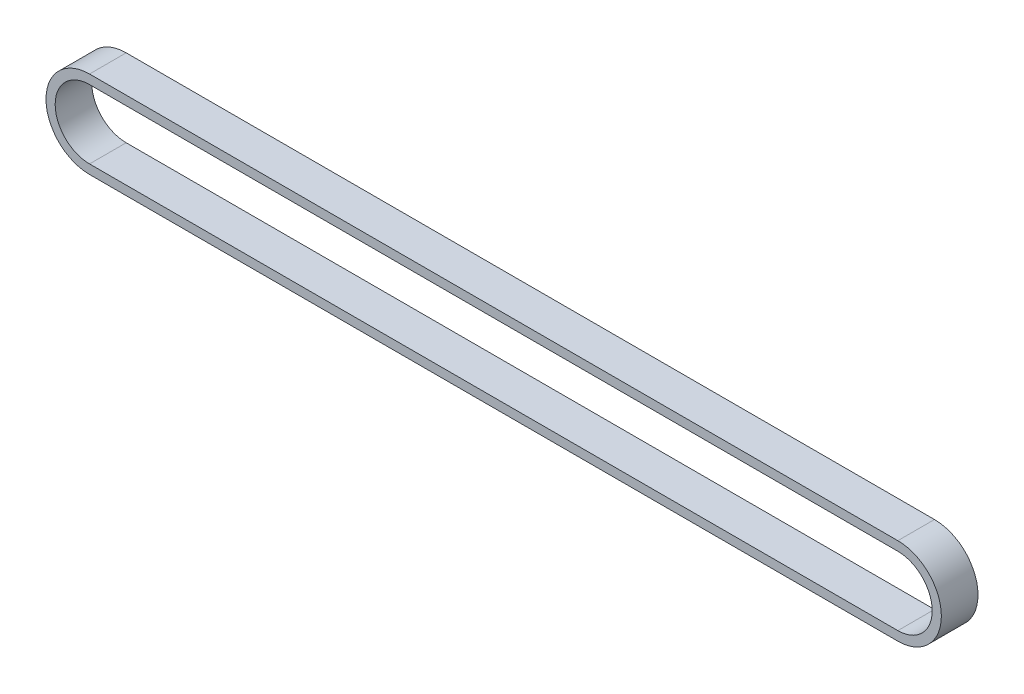
ISO-10303-21;
HEADER;
FILE_DESCRIPTION(('STEP AP214'),'2;1');
FILE_NAME('part.step','',(''),(''),'','','');
FILE_SCHEMA(('AUTOMOTIVE_DESIGN { 1 0 10303 214 1 1 1 1 }'));
ENDSEC;
DATA;
#1=APPLICATION_CONTEXT('core data for automotive mechanical design processes');
#2=APPLICATION_PROTOCOL_DEFINITION('international standard','automotive_design',2000,#1);
#3=PRODUCT_CONTEXT('',#1,'mechanical');
#4=PRODUCT('Part','Part','',(#3));
#5=PRODUCT_RELATED_PRODUCT_CATEGORY('part','',(#4));
#6=PRODUCT_DEFINITION_FORMATION('','',#4);
#7=PRODUCT_DEFINITION_CONTEXT('part definition',#1,'design');
#8=PRODUCT_DEFINITION('design','',#6,#7);
#9=PRODUCT_DEFINITION_SHAPE('','',#8);
#10=(LENGTH_UNIT() NAMED_UNIT(*) SI_UNIT(.MILLI.,.METRE.));
#11=(NAMED_UNIT(*) PLANE_ANGLE_UNIT() SI_UNIT($,.RADIAN.));
#12=(NAMED_UNIT(*) SI_UNIT($,.STERADIAN.) SOLID_ANGLE_UNIT());
#13=UNCERTAINTY_MEASURE_WITH_UNIT(LENGTH_MEASURE(1.E-05),#10,'distance_accuracy_value','');
#14=(GEOMETRIC_REPRESENTATION_CONTEXT(3) GLOBAL_UNCERTAINTY_ASSIGNED_CONTEXT((#13)) GLOBAL_UNIT_ASSIGNED_CONTEXT((#10,
#11,#12)) REPRESENTATION_CONTEXT('',''));
#15=CARTESIAN_POINT('',(0.,0.,0.));
#16=DIRECTION('',(0.,0.,1.));
#17=DIRECTION('',(1.,0.,0.));
#18=AXIS2_PLACEMENT_3D('',#15,#16,#17);
#19=CARTESIAN_POINT('',(-112.038165052,0.,10.16));
#20=DIRECTION('',(0.,0.,1.));
#21=DIRECTION('',(1.,0.,0.));
#22=AXIS2_PLACEMENT_3D('',#19,#20,#21);
#23=PLANE('',#22);
#24=CARTESIAN_POINT('',(-112.038165052,0.,10.16));
#25=DIRECTION('',(0.,0.,1.));
#26=DIRECTION('',(1.,0.,0.));
#27=AXIS2_PLACEMENT_3D('',#24,#25,#26);
#28=CIRCLE('',#27,12.065);
#29=CARTESIAN_POINT('',(-112.038165052,12.065,10.16));
#30=VERTEX_POINT('',#29);
#31=CARTESIAN_POINT('',(-112.038165052,-12.065,10.16));
#32=VERTEX_POINT('',#31);
#33=EDGE_CURVE('E135',#30,#32,#28,.T.);
#34=ORIENTED_EDGE('',*,*,#33,.T.);
#35=DIRECTION('',(1.,0.,0.));
#36=VECTOR('',#35,1.);
#37=CARTESIAN_POINT('',(-112.038165052,-12.065,10.16));
#38=LINE('',#37,#36);
#39=CARTESIAN_POINT('',(112.038165052,-12.0649999999999,10.16));
#40=VERTEX_POINT('',#39);
#41=EDGE_CURVE('E138',#32,#40,#38,.T.);
#42=ORIENTED_EDGE('',*,*,#41,.T.);
#43=CARTESIAN_POINT('',(112.038165052,0.,10.16));
#44=DIRECTION('',(0.,0.,1.));
#45=DIRECTION('',(1.,0.,0.));
#46=AXIS2_PLACEMENT_3D('',#43,#44,#45);
#47=CIRCLE('',#46,12.065);
#48=CARTESIAN_POINT('',(112.038165052,12.065,10.16));
#49=VERTEX_POINT('',#48);
#50=EDGE_CURVE('E141',#40,#49,#47,.T.);
#51=ORIENTED_EDGE('',*,*,#50,.T.);
#52=DIRECTION('',(-1.,0.,0.));
#53=VECTOR('',#52,1.);
#54=CARTESIAN_POINT('',(-112.038165052,12.065,10.16));
#55=LINE('',#54,#53);
#56=EDGE_CURVE('E143',#49,#30,#55,.T.);
#57=ORIENTED_EDGE('',*,*,#56,.T.);
#58=EDGE_LOOP('',(#34,#42,#51,#57));
#59=FACE_BOUND('',#58,.T.);
#60=DIRECTION('',(1.,0.,0.));
#61=VECTOR('',#60,1.);
#62=CARTESIAN_POINT('',(-112.038165052,-9.525,10.16));
#63=LINE('',#62,#61);
#64=CARTESIAN_POINT('',(-112.038165052,-9.525,10.16));
#65=VERTEX_POINT('',#64);
#66=CARTESIAN_POINT('',(112.038165052,-9.52499999999996,10.16));
#67=VERTEX_POINT('',#66);
#68=EDGE_CURVE('E107',#65,#67,#63,.T.);
#69=ORIENTED_EDGE('',*,*,#68,.F.);
#70=CARTESIAN_POINT('',(-112.038165052,0.,10.16));
#71=DIRECTION('',(0.,0.,1.));
#72=DIRECTION('',(1.,0.,0.));
#73=AXIS2_PLACEMENT_3D('',#70,#71,#72);
#74=CIRCLE('',#73,9.525);
#75=CARTESIAN_POINT('',(-112.038165052,9.525,10.16));
#76=VERTEX_POINT('',#75);
#77=EDGE_CURVE('E99',#76,#65,#74,.T.);
#78=ORIENTED_EDGE('',*,*,#77,.F.);
#79=DIRECTION('',(-1.,0.,0.));
#80=VECTOR('',#79,1.);
#81=CARTESIAN_POINT('',(-112.038165052,9.525,10.16));
#82=LINE('',#81,#80);
#83=CARTESIAN_POINT('',(112.038165052,9.52500000000004,10.16));
#84=VERTEX_POINT('',#83);
#85=EDGE_CURVE('E121',#84,#76,#82,.T.);
#86=ORIENTED_EDGE('',*,*,#85,.F.);
#87=CARTESIAN_POINT('',(112.038165052,0.,10.16));
#88=DIRECTION('',(0.,0.,1.));
#89=DIRECTION('',(1.,0.,0.));
#90=AXIS2_PLACEMENT_3D('',#87,#88,#89);
#91=CIRCLE('',#90,9.525);
#92=EDGE_CURVE('E119',#67,#84,#91,.T.);
#93=ORIENTED_EDGE('',*,*,#92,.F.);
#94=EDGE_LOOP('',(#69,#78,#86,#93));
#95=FACE_BOUND('',#94,.T.);
#96=ADVANCED_FACE('F34',(#59,#95),#23,.T.);
#97=CARTESIAN_POINT('',(-112.038165052,0.,0.));
#98=DIRECTION('',(0.,0.,1.));
#99=DIRECTION('',(1.,0.,0.));
#100=AXIS2_PLACEMENT_3D('',#97,#98,#99);
#101=PLANE('',#100);
#102=CARTESIAN_POINT('',(-112.038165052,0.,0.));
#103=DIRECTION('',(0.,0.,1.));
#104=DIRECTION('',(1.,0.,0.));
#105=AXIS2_PLACEMENT_3D('',#102,#103,#104);
#106=CIRCLE('',#105,12.065);
#107=CARTESIAN_POINT('',(-112.038165052,12.065,0.));
#108=VERTEX_POINT('',#107);
#109=CARTESIAN_POINT('',(-112.038165052,-12.065,0.));
#110=VERTEX_POINT('',#109);
#111=EDGE_CURVE('E115',#108,#110,#106,.T.);
#112=ORIENTED_EDGE('',*,*,#111,.F.);
#113=DIRECTION('',(-1.,0.,0.));
#114=VECTOR('',#113,1.);
#115=CARTESIAN_POINT('',(-112.038165052,12.065,0.));
#116=LINE('',#115,#114);
#117=CARTESIAN_POINT('',(112.038165052,12.065,0.));
#118=VERTEX_POINT('',#117);
#119=EDGE_CURVE('E139',#118,#108,#116,.T.);
#120=ORIENTED_EDGE('',*,*,#119,.F.);
#121=CARTESIAN_POINT('',(112.038165052,0.,0.));
#122=DIRECTION('',(0.,0.,1.));
#123=DIRECTION('',(1.,0.,0.));
#124=AXIS2_PLACEMENT_3D('',#121,#122,#123);
#125=CIRCLE('',#124,12.065);
#126=CARTESIAN_POINT('',(112.038165052,-12.0649999999999,0.));
#127=VERTEX_POINT('',#126);
#128=EDGE_CURVE('E150',#127,#118,#125,.T.);
#129=ORIENTED_EDGE('',*,*,#128,.F.);
#130=DIRECTION('',(1.,0.,0.));
#131=VECTOR('',#130,1.);
#132=CARTESIAN_POINT('',(-112.038165052,-12.065,0.));
#133=LINE('',#132,#131);
#134=EDGE_CURVE('E148',#110,#127,#133,.T.);
#135=ORIENTED_EDGE('',*,*,#134,.F.);
#136=EDGE_LOOP('',(#112,#120,#129,#135));
#137=FACE_BOUND('',#136,.T.);
#138=CARTESIAN_POINT('',(-112.038165052,0.,0.));
#139=DIRECTION('',(0.,0.,1.));
#140=DIRECTION('',(1.,0.,0.));
#141=AXIS2_PLACEMENT_3D('',#138,#139,#140);
#142=CIRCLE('',#141,9.525);
#143=CARTESIAN_POINT('',(-112.038165052,9.525,0.));
#144=VERTEX_POINT('',#143);
#145=CARTESIAN_POINT('',(-112.038165052,-9.525,0.));
#146=VERTEX_POINT('',#145);
#147=EDGE_CURVE('E57',#144,#146,#142,.T.);
#148=ORIENTED_EDGE('',*,*,#147,.T.);
#149=DIRECTION('',(1.,0.,0.));
#150=VECTOR('',#149,1.);
#151=CARTESIAN_POINT('',(-112.038165052,-9.525,0.));
#152=LINE('',#151,#150);
#153=CARTESIAN_POINT('',(112.038165052,-9.52499999999996,0.));
#154=VERTEX_POINT('',#153);
#155=EDGE_CURVE('E114',#146,#154,#152,.T.);
#156=ORIENTED_EDGE('',*,*,#155,.T.);
#157=CARTESIAN_POINT('',(112.038165052,0.,0.));
#158=DIRECTION('',(0.,0.,1.));
#159=DIRECTION('',(1.,0.,0.));
#160=AXIS2_PLACEMENT_3D('',#157,#158,#159);
#161=CIRCLE('',#160,9.525);
#162=CARTESIAN_POINT('',(112.038165052,9.52500000000004,0.));
#163=VERTEX_POINT('',#162);
#164=EDGE_CURVE('E127',#154,#163,#161,.T.);
#165=ORIENTED_EDGE('',*,*,#164,.T.);
#166=DIRECTION('',(-1.,0.,0.));
#167=VECTOR('',#166,1.);
#168=CARTESIAN_POINT('',(-112.038165052,9.525,0.));
#169=LINE('',#168,#167);
#170=EDGE_CURVE('E108',#163,#144,#169,.T.);
#171=ORIENTED_EDGE('',*,*,#170,.T.);
#172=EDGE_LOOP('',(#148,#156,#165,#171));
#173=FACE_BOUND('',#172,.T.);
#174=ADVANCED_FACE('F168',(#137,#173),#101,.F.);
#175=CARTESIAN_POINT('',(-112.038165052,0.,10.16));
#176=DIRECTION('',(0.,0.,-1.));
#177=DIRECTION('',(-1.,0.,0.));
#178=AXIS2_PLACEMENT_3D('',#175,#176,#177);
#179=CYLINDRICAL_SURFACE('',#178,12.065);
#180=ORIENTED_EDGE('',*,*,#111,.T.);
#181=DIRECTION('',(0.,0.,-1.));
#182=VECTOR('',#181,1.);
#183=CARTESIAN_POINT('',(-112.038165052,-12.065,10.16));
#184=LINE('',#183,#182);
#185=EDGE_CURVE('E11',#32,#110,#184,.T.);
#186=ORIENTED_EDGE('',*,*,#185,.F.);
#187=ORIENTED_EDGE('',*,*,#33,.F.);
#188=DIRECTION('',(0.,0.,-1.));
#189=VECTOR('',#188,1.);
#190=CARTESIAN_POINT('',(-112.038165052,12.065,10.16));
#191=LINE('',#190,#189);
#192=EDGE_CURVE('E145',#30,#108,#191,.T.);
#193=ORIENTED_EDGE('',*,*,#192,.T.);
#194=EDGE_LOOP('',(#180,#186,#187,#193));
#195=FACE_BOUND('',#194,.T.);
#196=ADVANCED_FACE('F36',(#195),#179,.T.);
#197=CARTESIAN_POINT('',(-112.038165052,-12.065,10.16));
#198=DIRECTION('',(0.,1.,0.));
#199=DIRECTION('',(-1.,0.,0.));
#200=AXIS2_PLACEMENT_3D('',#197,#198,#199);
#201=PLANE('',#200);
#202=ORIENTED_EDGE('',*,*,#134,.T.);
#203=DIRECTION('',(0.,0.,-1.));
#204=VECTOR('',#203,1.);
#205=CARTESIAN_POINT('',(112.038165052,-12.0649999999999,10.16));
#206=LINE('',#205,#204);
#207=EDGE_CURVE('E42',#40,#127,#206,.T.);
#208=ORIENTED_EDGE('',*,*,#207,.F.);
#209=ORIENTED_EDGE('',*,*,#41,.F.);
#210=ORIENTED_EDGE('',*,*,#185,.T.);
#211=EDGE_LOOP('',(#202,#208,#209,#210));
#212=FACE_BOUND('',#211,.T.);
#213=ADVANCED_FACE('F178',(#212),#201,.F.);
#214=CARTESIAN_POINT('',(112.038165052,0.,10.16));
#215=DIRECTION('',(0.,0.,-1.));
#216=DIRECTION('',(-1.,0.,0.));
#217=AXIS2_PLACEMENT_3D('',#214,#215,#216);
#218=CYLINDRICAL_SURFACE('',#217,12.065);
#219=ORIENTED_EDGE('',*,*,#128,.T.);
#220=DIRECTION('',(0.,0.,-1.));
#221=VECTOR('',#220,1.);
#222=CARTESIAN_POINT('',(112.038165052,12.065,10.16));
#223=LINE('',#222,#221);
#224=EDGE_CURVE('E155',#49,#118,#223,.T.);
#225=ORIENTED_EDGE('',*,*,#224,.F.);
#226=ORIENTED_EDGE('',*,*,#50,.F.);
#227=ORIENTED_EDGE('',*,*,#207,.T.);
#228=EDGE_LOOP('',(#219,#225,#226,#227));
#229=FACE_BOUND('',#228,.T.);
#230=ADVANCED_FACE('F162',(#229),#218,.T.);
#231=CARTESIAN_POINT('',(-112.038165052,12.065,10.16));
#232=DIRECTION('',(0.,-1.,0.));
#233=DIRECTION('',(0.,0.,-1.));
#234=AXIS2_PLACEMENT_3D('',#231,#232,#233);
#235=PLANE('',#234);
#236=ORIENTED_EDGE('',*,*,#119,.T.);
#237=ORIENTED_EDGE('',*,*,#192,.F.);
#238=ORIENTED_EDGE('',*,*,#56,.F.);
#239=ORIENTED_EDGE('',*,*,#224,.T.);
#240=EDGE_LOOP('',(#236,#237,#238,#239));
#241=FACE_BOUND('',#240,.T.);
#242=ADVANCED_FACE('F172',(#241),#235,.F.);
#243=CARTESIAN_POINT('',(-112.038165052,0.,10.16));
#244=DIRECTION('',(0.,0.,-1.));
#245=DIRECTION('',(-1.,0.,0.));
#246=AXIS2_PLACEMENT_3D('',#243,#244,#245);
#247=CYLINDRICAL_SURFACE('',#246,9.525);
#248=ORIENTED_EDGE('',*,*,#147,.F.);
#249=DIRECTION('',(0.,0.,-1.));
#250=VECTOR('',#249,1.);
#251=CARTESIAN_POINT('',(-112.038165052,9.525,10.16));
#252=LINE('',#251,#250);
#253=EDGE_CURVE('E103',#76,#144,#252,.T.);
#254=ORIENTED_EDGE('',*,*,#253,.F.);
#255=ORIENTED_EDGE('',*,*,#77,.T.);
#256=DIRECTION('',(0.,0.,-1.));
#257=VECTOR('',#256,1.);
#258=CARTESIAN_POINT('',(-112.038165052,-9.525,10.16));
#259=LINE('',#258,#257);
#260=EDGE_CURVE('E102',#65,#146,#259,.T.);
#261=ORIENTED_EDGE('',*,*,#260,.T.);
#262=EDGE_LOOP('',(#248,#254,#255,#261));
#263=FACE_BOUND('',#262,.T.);
#264=ADVANCED_FACE('F101',(#263),#247,.F.);
#265=CARTESIAN_POINT('',(-112.038165052,-9.525,10.16));
#266=DIRECTION('',(0.,1.,0.));
#267=DIRECTION('',(-1.,0.,0.));
#268=AXIS2_PLACEMENT_3D('',#265,#266,#267);
#269=PLANE('',#268);
#270=ORIENTED_EDGE('',*,*,#155,.F.);
#271=ORIENTED_EDGE('',*,*,#260,.F.);
#272=ORIENTED_EDGE('',*,*,#68,.T.);
#273=DIRECTION('',(0.,0.,-1.));
#274=VECTOR('',#273,1.);
#275=CARTESIAN_POINT('',(112.038165052,-9.52499999999996,10.16));
#276=LINE('',#275,#274);
#277=EDGE_CURVE('E116',#67,#154,#276,.T.);
#278=ORIENTED_EDGE('',*,*,#277,.T.);
#279=EDGE_LOOP('',(#270,#271,#272,#278));
#280=FACE_BOUND('',#279,.T.);
#281=ADVANCED_FACE('F111',(#280),#269,.T.);
#282=CARTESIAN_POINT('',(112.038165052,0.,10.16));
#283=DIRECTION('',(0.,0.,-1.));
#284=DIRECTION('',(-1.,0.,0.));
#285=AXIS2_PLACEMENT_3D('',#282,#283,#284);
#286=CYLINDRICAL_SURFACE('',#285,9.525);
#287=ORIENTED_EDGE('',*,*,#164,.F.);
#288=ORIENTED_EDGE('',*,*,#277,.F.);
#289=ORIENTED_EDGE('',*,*,#92,.T.);
#290=DIRECTION('',(0.,0.,-1.));
#291=VECTOR('',#290,1.);
#292=CARTESIAN_POINT('',(112.038165052,9.52500000000004,10.16));
#293=LINE('',#292,#291);
#294=EDGE_CURVE('E49',#84,#163,#293,.T.);
#295=ORIENTED_EDGE('',*,*,#294,.T.);
#296=EDGE_LOOP('',(#287,#288,#289,#295));
#297=FACE_BOUND('',#296,.T.);
#298=ADVANCED_FACE('F201',(#297),#286,.F.);
#299=CARTESIAN_POINT('',(-112.038165052,9.525,10.16));
#300=DIRECTION('',(0.,-1.,0.));
#301=DIRECTION('',(1.,0.,0.));
#302=AXIS2_PLACEMENT_3D('',#299,#300,#301);
#303=PLANE('',#302);
#304=ORIENTED_EDGE('',*,*,#170,.F.);
#305=ORIENTED_EDGE('',*,*,#294,.F.);
#306=ORIENTED_EDGE('',*,*,#85,.T.);
#307=ORIENTED_EDGE('',*,*,#253,.T.);
#308=EDGE_LOOP('',(#304,#305,#306,#307));
#309=FACE_BOUND('',#308,.T.);
#310=ADVANCED_FACE('F205',(#309),#303,.T.);
#311=CLOSED_SHELL('',(#96,#174,#196,#213,#230,#242,#264,#281,#298,#310));
#312=MANIFOLD_SOLID_BREP('B2',#311);
#313=ADVANCED_BREP_SHAPE_REPRESENTATION('',(#18,#312),#14);
#314=SHAPE_DEFINITION_REPRESENTATION(#9,#313);
ENDSEC;
END-ISO-10303-21;
